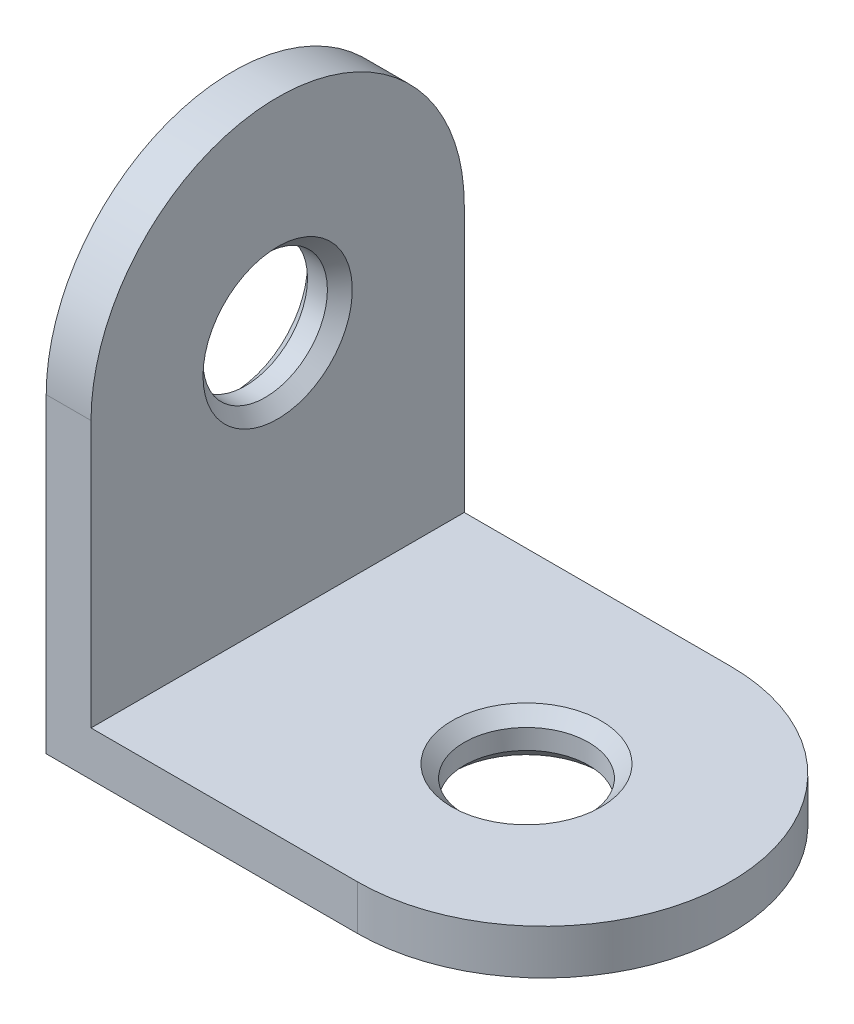
ISO-10303-21;
HEADER;
FILE_DESCRIPTION(('STEP AP214'),'2;1');
FILE_NAME('part.step','',(''),(''),'','','');
FILE_SCHEMA(('AUTOMOTIVE_DESIGN { 1 0 10303 214 1 1 1 1 }'));
ENDSEC;
DATA;
#1=APPLICATION_CONTEXT('core data for automotive mechanical design processes');
#2=APPLICATION_PROTOCOL_DEFINITION('international standard','automotive_design',2000,#1);
#3=PRODUCT_CONTEXT('',#1,'mechanical');
#4=PRODUCT('Part','Part','',(#3));
#5=PRODUCT_RELATED_PRODUCT_CATEGORY('part','',(#4));
#6=PRODUCT_DEFINITION_FORMATION('','',#4);
#7=PRODUCT_DEFINITION_CONTEXT('part definition',#1,'design');
#8=PRODUCT_DEFINITION('design','',#6,#7);
#9=PRODUCT_DEFINITION_SHAPE('','',#8);
#10=(LENGTH_UNIT() NAMED_UNIT(*) SI_UNIT(.MILLI.,.METRE.));
#11=(NAMED_UNIT(*) PLANE_ANGLE_UNIT() SI_UNIT($,.RADIAN.));
#12=(NAMED_UNIT(*) SI_UNIT($,.STERADIAN.) SOLID_ANGLE_UNIT());
#13=UNCERTAINTY_MEASURE_WITH_UNIT(LENGTH_MEASURE(1.E-05),#10,'distance_accuracy_value','');
#14=(GEOMETRIC_REPRESENTATION_CONTEXT(3) GLOBAL_UNCERTAINTY_ASSIGNED_CONTEXT((#13)) GLOBAL_UNIT_ASSIGNED_CONTEXT((#10,
#11,#12)) REPRESENTATION_CONTEXT('',''));
#15=CARTESIAN_POINT('',(0.,0.,0.));
#16=DIRECTION('',(0.,0.,1.));
#17=DIRECTION('',(1.,0.,0.));
#18=AXIS2_PLACEMENT_3D('',#15,#16,#17);
#19=CARTESIAN_POINT('',(12.5,0.,7.5));
#20=DIRECTION('',(0.,1.,0.));
#21=DIRECTION('',(-1.,0.,0.));
#22=AXIS2_PLACEMENT_3D('',#19,#20,#21);
#23=CYLINDRICAL_SURFACE('',#22,7.5);
#24=DIRECTION('',(0.,-1.,0.));
#25=VECTOR('',#24,1.);
#26=CARTESIAN_POINT('',(12.5,0.,15.));
#27=LINE('',#26,#25);
#28=CARTESIAN_POINT('',(12.5,0.,15.));
#29=VERTEX_POINT('',#28);
#30=CARTESIAN_POINT('',(12.5,1.8,15.));
#31=VERTEX_POINT('',#30);
#32=EDGE_CURVE('E126',#29,#31,#27,.F.);
#33=ORIENTED_EDGE('',*,*,#32,.F.);
#34=CARTESIAN_POINT('',(12.5,0.,7.5));
#35=DIRECTION('',(0.,1.,0.));
#36=DIRECTION('',(0.,0.,1.));
#37=AXIS2_PLACEMENT_3D('',#34,#35,#36);
#38=CIRCLE('',#37,7.5);
#39=CARTESIAN_POINT('',(12.5,0.,0.));
#40=VERTEX_POINT('',#39);
#41=EDGE_CURVE('E49',#40,#29,#38,.F.);
#42=ORIENTED_EDGE('',*,*,#41,.F.);
#43=DIRECTION('',(0.,1.,0.));
#44=VECTOR('',#43,1.);
#45=CARTESIAN_POINT('',(12.5,0.,0.));
#46=LINE('',#45,#44);
#47=CARTESIAN_POINT('',(12.5,1.8,0.));
#48=VERTEX_POINT('',#47);
#49=EDGE_CURVE('E128',#48,#40,#46,.F.);
#50=ORIENTED_EDGE('',*,*,#49,.F.);
#51=CARTESIAN_POINT('',(12.5,1.8,7.5));
#52=DIRECTION('',(0.,-1.,0.));
#53=DIRECTION('',(1.,0.,0.));
#54=AXIS2_PLACEMENT_3D('',#51,#52,#53);
#55=CIRCLE('',#54,7.5);
#56=EDGE_CURVE('E57',#31,#48,#55,.F.);
#57=ORIENTED_EDGE('',*,*,#56,.F.);
#58=EDGE_LOOP('',(#33,#42,#50,#57));
#59=FACE_BOUND('',#58,.T.);
#60=ADVANCED_FACE('F34',(#59),#23,.T.);
#61=CARTESIAN_POINT('',(1.8,12.5,7.5));
#62=DIRECTION('',(-1.,0.,0.));
#63=DIRECTION('',(0.,0.,1.));
#64=AXIS2_PLACEMENT_3D('',#61,#62,#63);
#65=CYLINDRICAL_SURFACE('',#64,7.5);
#66=DIRECTION('',(1.,0.,0.));
#67=VECTOR('',#66,1.);
#68=CARTESIAN_POINT('',(1.8,12.5,15.));
#69=LINE('',#68,#67);
#70=CARTESIAN_POINT('',(1.8,12.5,15.));
#71=VERTEX_POINT('',#70);
#72=CARTESIAN_POINT('',(0.,12.5,15.));
#73=VERTEX_POINT('',#72);
#74=EDGE_CURVE('E95',#71,#73,#69,.F.);
#75=ORIENTED_EDGE('',*,*,#74,.F.);
#76=CARTESIAN_POINT('',(1.8,12.5,7.5));
#77=DIRECTION('',(-1.,0.,0.));
#78=DIRECTION('',(0.,0.,1.));
#79=AXIS2_PLACEMENT_3D('',#76,#77,#78);
#80=CIRCLE('',#79,7.5);
#81=CARTESIAN_POINT('',(1.8,12.5,0.));
#82=VERTEX_POINT('',#81);
#83=EDGE_CURVE('E122',#82,#71,#80,.F.);
#84=ORIENTED_EDGE('',*,*,#83,.F.);
#85=DIRECTION('',(-1.,0.,0.));
#86=VECTOR('',#85,1.);
#87=CARTESIAN_POINT('',(0.,12.5,0.));
#88=LINE('',#87,#86);
#89=CARTESIAN_POINT('',(0.,12.5,0.));
#90=VERTEX_POINT('',#89);
#91=EDGE_CURVE('E113',#90,#82,#88,.F.);
#92=ORIENTED_EDGE('',*,*,#91,.F.);
#93=CARTESIAN_POINT('',(0.,12.5,7.5));
#94=DIRECTION('',(1.,0.,0.));
#95=DIRECTION('',(0.,0.,-1.));
#96=AXIS2_PLACEMENT_3D('',#93,#94,#95);
#97=CIRCLE('',#96,7.5);
#98=EDGE_CURVE('E124',#73,#90,#97,.F.);
#99=ORIENTED_EDGE('',*,*,#98,.F.);
#100=EDGE_LOOP('',(#75,#84,#92,#99));
#101=FACE_BOUND('',#100,.T.);
#102=ADVANCED_FACE('F177',(#101),#65,.T.);
#103=CARTESIAN_POINT('',(0.,20.,15.));
#104=DIRECTION('',(1.,0.,0.));
#105=DIRECTION('',(0.,0.,-1.));
#106=AXIS2_PLACEMENT_3D('',#103,#104,#105);
#107=PLANE('',#106);
#108=CARTESIAN_POINT('',(0.,11.8,7.5));
#109=DIRECTION('',(1.,0.,0.));
#110=DIRECTION('',(0.,0.,-1.));
#111=AXIS2_PLACEMENT_3D('',#108,#109,#110);
#112=CIRCLE('',#111,3.);
#113=CARTESIAN_POINT('',(0.,11.8,4.5));
#114=VERTEX_POINT('',#113);
#115=EDGE_CURVE('E141',#114,#114,#112,.T.);
#116=ORIENTED_EDGE('',*,*,#115,.T.);
#117=EDGE_LOOP('',(#116));
#118=FACE_BOUND('',#117,.T.);
#119=DIRECTION('',(0.,-1.,0.));
#120=VECTOR('',#119,1.);
#121=CARTESIAN_POINT('',(0.,20.,15.));
#122=LINE('',#121,#120);
#123=CARTESIAN_POINT('',(0.,0.,15.));
#124=VERTEX_POINT('',#123);
#125=EDGE_CURVE('E88',#73,#124,#122,.T.);
#126=ORIENTED_EDGE('',*,*,#125,.F.);
#127=ORIENTED_EDGE('',*,*,#98,.T.);
#128=DIRECTION('',(0.,-1.,0.));
#129=VECTOR('',#128,1.);
#130=CARTESIAN_POINT('',(0.,20.,0.));
#131=LINE('',#130,#129);
#132=CARTESIAN_POINT('',(0.,0.,0.));
#133=VERTEX_POINT('',#132);
#134=EDGE_CURVE('E109',#90,#133,#131,.T.);
#135=ORIENTED_EDGE('',*,*,#134,.T.);
#136=DIRECTION('',(0.,0.,-1.));
#137=VECTOR('',#136,1.);
#138=CARTESIAN_POINT('',(0.,0.,15.));
#139=LINE('',#138,#137);
#140=EDGE_CURVE('E104',#124,#133,#139,.T.);
#141=ORIENTED_EDGE('',*,*,#140,.F.);
#142=EDGE_LOOP('',(#126,#127,#135,#141));
#143=FACE_BOUND('',#142,.T.);
#144=ADVANCED_FACE('F107',(#118,#143),#107,.F.);
#145=CARTESIAN_POINT('',(0.,0.,15.));
#146=DIRECTION('',(0.,1.,0.));
#147=DIRECTION('',(0.,0.,1.));
#148=AXIS2_PLACEMENT_3D('',#145,#146,#147);
#149=PLANE('',#148);
#150=CARTESIAN_POINT('',(11.8,0.,7.5));
#151=DIRECTION('',(0.,1.,0.));
#152=DIRECTION('',(0.,0.,1.));
#153=AXIS2_PLACEMENT_3D('',#150,#151,#152);
#154=CIRCLE('',#153,3.);
#155=CARTESIAN_POINT('',(11.8,0.,10.5));
#156=VERTEX_POINT('',#155);
#157=EDGE_CURVE('E132',#156,#156,#154,.T.);
#158=ORIENTED_EDGE('',*,*,#157,.T.);
#159=EDGE_LOOP('',(#158));
#160=FACE_BOUND('',#159,.T.);
#161=DIRECTION('',(1.,0.,0.));
#162=VECTOR('',#161,1.);
#163=CARTESIAN_POINT('',(0.,0.,0.));
#164=LINE('',#163,#162);
#165=EDGE_CURVE('E293',#133,#40,#164,.T.);
#166=ORIENTED_EDGE('',*,*,#165,.T.);
#167=ORIENTED_EDGE('',*,*,#41,.T.);
#168=DIRECTION('',(1.,0.,0.));
#169=VECTOR('',#168,1.);
#170=CARTESIAN_POINT('',(0.,0.,15.));
#171=LINE('',#170,#169);
#172=EDGE_CURVE('E92',#124,#29,#171,.T.);
#173=ORIENTED_EDGE('',*,*,#172,.F.);
#174=ORIENTED_EDGE('',*,*,#140,.T.);
#175=EDGE_LOOP('',(#166,#167,#173,#174));
#176=FACE_BOUND('',#175,.T.);
#177=ADVANCED_FACE('F103',(#160,#176),#149,.F.);
#178=CARTESIAN_POINT('',(20.,1.8,15.));
#179=DIRECTION('',(0.,-1.,0.));
#180=DIRECTION('',(1.,0.,0.));
#181=AXIS2_PLACEMENT_3D('',#178,#179,#180);
#182=PLANE('',#181);
#183=CARTESIAN_POINT('',(11.8,1.8,7.5));
#184=DIRECTION('',(0.,-1.,0.));
#185=DIRECTION('',(1.,0.,0.));
#186=AXIS2_PLACEMENT_3D('',#183,#184,#185);
#187=CIRCLE('',#186,3.00000000000002);
#188=CARTESIAN_POINT('',(14.8,1.8,7.5));
#189=VERTEX_POINT('',#188);
#190=EDGE_CURVE('E42',#189,#189,#187,.T.);
#191=ORIENTED_EDGE('',*,*,#190,.T.);
#192=EDGE_LOOP('',(#191));
#193=FACE_BOUND('',#192,.T.);
#194=DIRECTION('',(-1.,0.,0.));
#195=VECTOR('',#194,1.);
#196=CARTESIAN_POINT('',(20.,1.8,15.));
#197=LINE('',#196,#195);
#198=CARTESIAN_POINT('',(1.8,1.8,15.));
#199=VERTEX_POINT('',#198);
#200=EDGE_CURVE('E105',#31,#199,#197,.T.);
#201=ORIENTED_EDGE('',*,*,#200,.F.);
#202=ORIENTED_EDGE('',*,*,#56,.T.);
#203=DIRECTION('',(-1.,0.,0.));
#204=VECTOR('',#203,1.);
#205=CARTESIAN_POINT('',(20.,1.8,0.));
#206=LINE('',#205,#204);
#207=CARTESIAN_POINT('',(1.8,1.8,0.));
#208=VERTEX_POINT('',#207);
#209=EDGE_CURVE('E292',#48,#208,#206,.T.);
#210=ORIENTED_EDGE('',*,*,#209,.T.);
#211=DIRECTION('',(0.,0.,-1.));
#212=VECTOR('',#211,1.);
#213=CARTESIAN_POINT('',(1.8,1.8,15.));
#214=LINE('',#213,#212);
#215=EDGE_CURVE('E111',#199,#208,#214,.T.);
#216=ORIENTED_EDGE('',*,*,#215,.F.);
#217=EDGE_LOOP('',(#201,#202,#210,#216));
#218=FACE_BOUND('',#217,.T.);
#219=ADVANCED_FACE('F152',(#193,#218),#182,.F.);
#220=CARTESIAN_POINT('',(1.8,1.8,15.));
#221=DIRECTION('',(-1.,0.,0.));
#222=DIRECTION('',(0.,0.,1.));
#223=AXIS2_PLACEMENT_3D('',#220,#221,#222);
#224=PLANE('',#223);
#225=CARTESIAN_POINT('',(1.8,11.8,7.5));
#226=DIRECTION('',(-1.,0.,0.));
#227=DIRECTION('',(0.,0.,1.));
#228=AXIS2_PLACEMENT_3D('',#225,#226,#227);
#229=CIRCLE('',#228,2.99999999999999);
#230=CARTESIAN_POINT('',(1.8,11.8,10.5));
#231=VERTEX_POINT('',#230);
#232=EDGE_CURVE('E11',#231,#231,#229,.T.);
#233=ORIENTED_EDGE('',*,*,#232,.T.);
#234=EDGE_LOOP('',(#233));
#235=FACE_BOUND('',#234,.T.);
#236=DIRECTION('',(0.,1.,0.));
#237=VECTOR('',#236,1.);
#238=CARTESIAN_POINT('',(1.8,1.8,0.));
#239=LINE('',#238,#237);
#240=EDGE_CURVE('E98',#208,#82,#239,.T.);
#241=ORIENTED_EDGE('',*,*,#240,.T.);
#242=ORIENTED_EDGE('',*,*,#83,.T.);
#243=DIRECTION('',(0.,1.,0.));
#244=VECTOR('',#243,1.);
#245=CARTESIAN_POINT('',(1.8,1.8,15.));
#246=LINE('',#245,#244);
#247=EDGE_CURVE('E116',#199,#71,#246,.T.);
#248=ORIENTED_EDGE('',*,*,#247,.F.);
#249=ORIENTED_EDGE('',*,*,#215,.T.);
#250=EDGE_LOOP('',(#241,#242,#248,#249));
#251=FACE_BOUND('',#250,.T.);
#252=ADVANCED_FACE('F210',(#235,#251),#224,.F.);
#253=CARTESIAN_POINT('',(0.,0.,15.));
#254=DIRECTION('',(0.,0.,1.));
#255=DIRECTION('',(1.,0.,0.));
#256=AXIS2_PLACEMENT_3D('',#253,#254,#255);
#257=PLANE('',#256);
#258=ORIENTED_EDGE('',*,*,#172,.T.);
#259=ORIENTED_EDGE('',*,*,#32,.T.);
#260=ORIENTED_EDGE('',*,*,#200,.T.);
#261=ORIENTED_EDGE('',*,*,#247,.T.);
#262=ORIENTED_EDGE('',*,*,#74,.T.);
#263=ORIENTED_EDGE('',*,*,#125,.T.);
#264=EDGE_LOOP('',(#258,#259,#260,#261,#262,#263));
#265=FACE_BOUND('',#264,.T.);
#266=ADVANCED_FACE('F90',(#265),#257,.T.);
#267=CARTESIAN_POINT('',(0.,0.,0.));
#268=DIRECTION('',(0.,0.,1.));
#269=DIRECTION('',(1.,0.,0.));
#270=AXIS2_PLACEMENT_3D('',#267,#268,#269);
#271=PLANE('',#270);
#272=ORIENTED_EDGE('',*,*,#209,.F.);
#273=ORIENTED_EDGE('',*,*,#49,.T.);
#274=ORIENTED_EDGE('',*,*,#165,.F.);
#275=ORIENTED_EDGE('',*,*,#134,.F.);
#276=ORIENTED_EDGE('',*,*,#91,.T.);
#277=ORIENTED_EDGE('',*,*,#240,.F.);
#278=EDGE_LOOP('',(#272,#273,#274,#275,#276,#277));
#279=FACE_BOUND('',#278,.T.);
#280=ADVANCED_FACE('F163',(#279),#271,.F.);
#281=CARTESIAN_POINT('',(11.8,-8.2,7.5));
#282=DIRECTION('',(0.,1.,0.));
#283=DIRECTION('',(-1.,0.,0.));
#284=AXIS2_PLACEMENT_3D('',#281,#282,#283);
#285=CYLINDRICAL_SURFACE('',#284,2.5);
#286=CARTESIAN_POINT('',(11.8,0.500000000000004,7.5));
#287=DIRECTION('',(0.,1.,0.));
#288=DIRECTION('',(0.,0.,1.));
#289=AXIS2_PLACEMENT_3D('',#286,#287,#288);
#290=CIRCLE('',#289,2.5);
#291=CARTESIAN_POINT('',(11.8,0.500000000000004,10.));
#292=VERTEX_POINT('',#291);
#293=EDGE_CURVE('E138',#292,#292,#290,.F.);
#294=ORIENTED_EDGE('',*,*,#293,.T.);
#295=EDGE_LOOP('',(#294));
#296=FACE_BOUND('',#295,.T.);
#297=CARTESIAN_POINT('',(11.8,1.29999999999999,7.5));
#298=DIRECTION('',(0.,-1.,0.));
#299=DIRECTION('',(0.,0.,-1.));
#300=AXIS2_PLACEMENT_3D('',#297,#298,#299);
#301=CIRCLE('',#300,2.5);
#302=CARTESIAN_POINT('',(11.8,1.29999999999999,5.));
#303=VERTEX_POINT('',#302);
#304=EDGE_CURVE('E135',#303,#303,#301,.F.);
#305=ORIENTED_EDGE('',*,*,#304,.T.);
#306=EDGE_LOOP('',(#305));
#307=FACE_BOUND('',#306,.T.);
#308=ADVANCED_FACE('F160',(#296,#307),#285,.F.);
#309=CARTESIAN_POINT('',(-8.2,11.8,7.5));
#310=DIRECTION('',(1.,0.,0.));
#311=DIRECTION('',(0.,0.,-1.));
#312=AXIS2_PLACEMENT_3D('',#309,#310,#311);
#313=CYLINDRICAL_SURFACE('',#312,2.5);
#314=CARTESIAN_POINT('',(0.500000000000004,11.8,7.5));
#315=DIRECTION('',(1.,0.,0.));
#316=DIRECTION('',(0.,0.,-1.));
#317=AXIS2_PLACEMENT_3D('',#314,#315,#316);
#318=CIRCLE('',#317,2.5);
#319=CARTESIAN_POINT('',(0.500000000000004,11.8,5.));
#320=VERTEX_POINT('',#319);
#321=EDGE_CURVE('E147',#320,#320,#318,.F.);
#322=ORIENTED_EDGE('',*,*,#321,.T.);
#323=EDGE_LOOP('',(#322));
#324=FACE_BOUND('',#323,.T.);
#325=CARTESIAN_POINT('',(1.30000000000001,11.8,7.5));
#326=DIRECTION('',(-1.,0.,0.));
#327=DIRECTION('',(0.,0.,1.));
#328=AXIS2_PLACEMENT_3D('',#325,#326,#327);
#329=CIRCLE('',#328,2.5);
#330=CARTESIAN_POINT('',(1.30000000000001,11.8,10.));
#331=VERTEX_POINT('',#330);
#332=EDGE_CURVE('E144',#331,#331,#329,.F.);
#333=ORIENTED_EDGE('',*,*,#332,.T.);
#334=EDGE_LOOP('',(#333));
#335=FACE_BOUND('',#334,.T.);
#336=ADVANCED_FACE('F162',(#324,#335),#313,.F.);
#337=CARTESIAN_POINT('',(11.8,0.,7.5));
#338=DIRECTION('',(0.,-1.,0.));
#339=DIRECTION('',(0.,0.,-1.));
#340=AXIS2_PLACEMENT_3D('',#337,#338,#339);
#341=CONICAL_SURFACE('',#340,3.,0.785398163397447);
#342=ORIENTED_EDGE('',*,*,#293,.F.);
#343=EDGE_LOOP('',(#342));
#344=FACE_BOUND('',#343,.T.);
#345=ORIENTED_EDGE('',*,*,#157,.F.);
#346=EDGE_LOOP('',(#345));
#347=FACE_BOUND('',#346,.T.);
#348=ADVANCED_FACE('F170',(#344,#347),#341,.F.);
#349=CARTESIAN_POINT('',(0.,11.8,7.5));
#350=DIRECTION('',(-1.,0.,0.));
#351=DIRECTION('',(0.,0.,1.));
#352=AXIS2_PLACEMENT_3D('',#349,#350,#351);
#353=CONICAL_SURFACE('',#352,3.,0.785398163397447);
#354=ORIENTED_EDGE('',*,*,#321,.F.);
#355=EDGE_LOOP('',(#354));
#356=FACE_BOUND('',#355,.T.);
#357=ORIENTED_EDGE('',*,*,#115,.F.);
#358=EDGE_LOOP('',(#357));
#359=FACE_BOUND('',#358,.T.);
#360=ADVANCED_FACE('F157',(#356,#359),#353,.F.);
#361=CARTESIAN_POINT('',(11.8,1.29999999999999,7.5));
#362=DIRECTION('',(0.,1.,0.));
#363=DIRECTION('',(0.,0.,1.));
#364=AXIS2_PLACEMENT_3D('',#361,#362,#363);
#365=CONICAL_SURFACE('',#364,2.5,0.785398163397455);
#366=ORIENTED_EDGE('',*,*,#190,.F.);
#367=EDGE_LOOP('',(#366));
#368=FACE_BOUND('',#367,.T.);
#369=ORIENTED_EDGE('',*,*,#304,.F.);
#370=EDGE_LOOP('',(#369));
#371=FACE_BOUND('',#370,.T.);
#372=ADVANCED_FACE('F154',(#368,#371),#365,.F.);
#373=CARTESIAN_POINT('',(1.30000000000001,11.8,7.5));
#374=DIRECTION('',(1.,0.,0.));
#375=DIRECTION('',(0.,0.,-1.));
#376=AXIS2_PLACEMENT_3D('',#373,#374,#375);
#377=CONICAL_SURFACE('',#376,2.5,0.785398163397447);
#378=ORIENTED_EDGE('',*,*,#232,.F.);
#379=EDGE_LOOP('',(#378));
#380=FACE_BOUND('',#379,.T.);
#381=ORIENTED_EDGE('',*,*,#332,.F.);
#382=EDGE_LOOP('',(#381));
#383=FACE_BOUND('',#382,.T.);
#384=ADVANCED_FACE('F36',(#380,#383),#377,.F.);
#385=CLOSED_SHELL('',(#60,#102,#144,#177,#219,#252,#266,#280,#308,#336,#348,#360,#372,#384));
#386=MANIFOLD_SOLID_BREP('B2',#385);
#387=ADVANCED_BREP_SHAPE_REPRESENTATION('',(#18,#386),#14);
#388=SHAPE_DEFINITION_REPRESENTATION(#9,#387);
ENDSEC;
END-ISO-10303-21;
